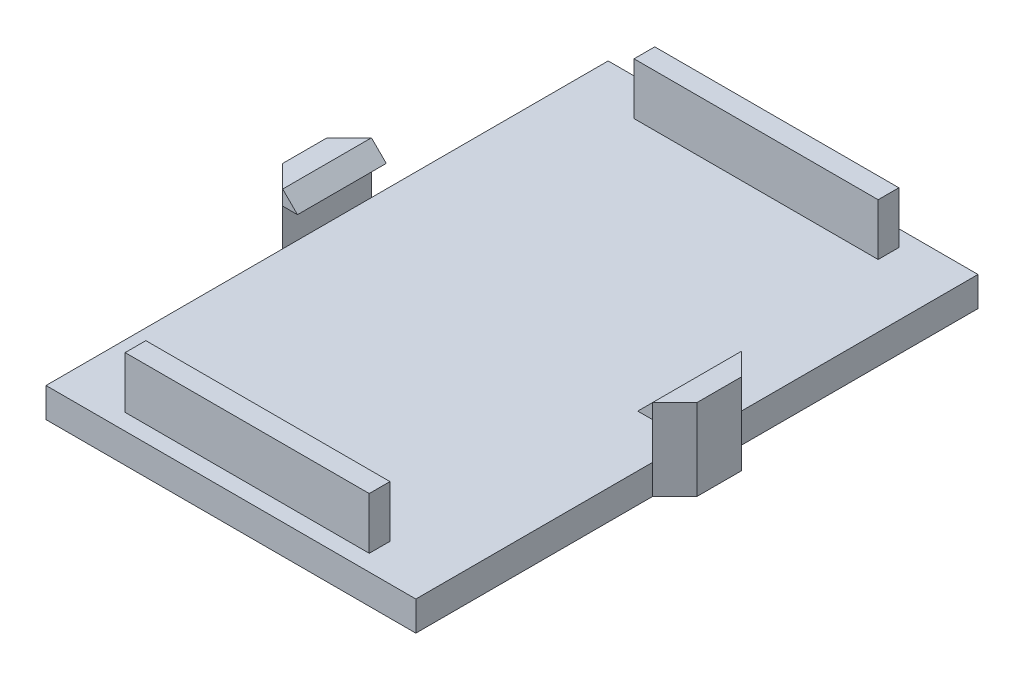
ISO-10303-21;
HEADER;
FILE_DESCRIPTION(('STEP AP214'),'2;1');
FILE_NAME('part.step','',(''),(''),'','','');
FILE_SCHEMA(('AUTOMOTIVE_DESIGN { 1 0 10303 214 1 1 1 1 }'));
ENDSEC;
DATA;
#1=APPLICATION_CONTEXT('core data for automotive mechanical design processes');
#2=APPLICATION_PROTOCOL_DEFINITION('international standard','automotive_design',2000,#1);
#3=PRODUCT_CONTEXT('',#1,'mechanical');
#4=PRODUCT('Part','Part','',(#3));
#5=PRODUCT_RELATED_PRODUCT_CATEGORY('part','',(#4));
#6=PRODUCT_DEFINITION_FORMATION('','',#4);
#7=PRODUCT_DEFINITION_CONTEXT('part definition',#1,'design');
#8=PRODUCT_DEFINITION('design','',#6,#7);
#9=PRODUCT_DEFINITION_SHAPE('','',#8);
#10=(LENGTH_UNIT() NAMED_UNIT(*) SI_UNIT(.MILLI.,.METRE.));
#11=(NAMED_UNIT(*) PLANE_ANGLE_UNIT() SI_UNIT($,.RADIAN.));
#12=(NAMED_UNIT(*) SI_UNIT($,.STERADIAN.) SOLID_ANGLE_UNIT());
#13=UNCERTAINTY_MEASURE_WITH_UNIT(LENGTH_MEASURE(1.E-05),#10,'distance_accuracy_value','');
#14=(GEOMETRIC_REPRESENTATION_CONTEXT(3) GLOBAL_UNCERTAINTY_ASSIGNED_CONTEXT((#13)) GLOBAL_UNIT_ASSIGNED_CONTEXT((#10,
#11,#12)) REPRESENTATION_CONTEXT('',''));
#15=CARTESIAN_POINT('',(0.,0.,0.));
#16=DIRECTION('',(0.,0.,1.));
#17=DIRECTION('',(1.,0.,0.));
#18=AXIS2_PLACEMENT_3D('',#15,#16,#17);
#19=CARTESIAN_POINT('',(-12.5,5.5,0.));
#20=DIRECTION('',(-1.,0.,0.));
#21=DIRECTION('',(0.,0.,1.));
#22=AXIS2_PLACEMENT_3D('',#19,#20,#21);
#23=PLANE('',#22);
#24=DIRECTION('',(0.,0.,-1.));
#25=VECTOR('',#24,1.);
#26=CARTESIAN_POINT('',(-12.5,4.5,2.99999999999999));
#27=LINE('',#26,#25);
#28=CARTESIAN_POINT('',(-12.5,4.5,2.99999999999999));
#29=VERTEX_POINT('',#28);
#30=CARTESIAN_POINT('',(-12.5,4.5,-3.));
#31=VERTEX_POINT('',#30);
#32=EDGE_CURVE('E241',#29,#31,#27,.T.);
#33=ORIENTED_EDGE('',*,*,#32,.F.);
#34=DIRECTION('',(0.,-1.,0.));
#35=VECTOR('',#34,1.);
#36=CARTESIAN_POINT('',(-12.5,5.5,2.99999999999999));
#37=LINE('',#36,#35);
#38=CARTESIAN_POINT('',(-12.5,2.,2.99999999999999));
#39=VERTEX_POINT('',#38);
#40=EDGE_CURVE('E386',#29,#39,#37,.T.);
#41=ORIENTED_EDGE('',*,*,#40,.T.);
#42=DIRECTION('',(0.,0.,-1.));
#43=VECTOR('',#42,1.);
#44=CARTESIAN_POINT('',(-12.5,2.,0.));
#45=LINE('',#44,#43);
#46=CARTESIAN_POINT('',(-12.5,2.,-2.99999999999999));
#47=VERTEX_POINT('',#46);
#48=EDGE_CURVE('E448',#39,#47,#45,.T.);
#49=ORIENTED_EDGE('',*,*,#48,.T.);
#50=DIRECTION('',(0.,-1.,0.));
#51=VECTOR('',#50,1.);
#52=CARTESIAN_POINT('',(-12.5,5.5,-2.99999999999999));
#53=LINE('',#52,#51);
#54=EDGE_CURVE('E406',#31,#47,#53,.T.);
#55=ORIENTED_EDGE('',*,*,#54,.F.);
#56=EDGE_LOOP('',(#33,#41,#49,#55));
#57=FACE_BOUND('',#56,.T.);
#58=ADVANCED_FACE('F47',(#57),#23,.F.);
#59=CARTESIAN_POINT('',(12.5,5.5,0.));
#60=DIRECTION('',(-1.,0.,0.));
#61=DIRECTION('',(0.,0.,1.));
#62=AXIS2_PLACEMENT_3D('',#59,#60,#61);
#63=PLANE('',#62);
#64=DIRECTION('',(0.,-1.,0.));
#65=VECTOR('',#64,1.);
#66=CARTESIAN_POINT('',(12.5,5.5,2.99999999999999));
#67=LINE('',#66,#65);
#68=CARTESIAN_POINT('',(12.5,4.5,2.99999999999999));
#69=VERTEX_POINT('',#68);
#70=CARTESIAN_POINT('',(12.5,2.,2.99999999999999));
#71=VERTEX_POINT('',#70);
#72=EDGE_CURVE('E60',#69,#71,#67,.T.);
#73=ORIENTED_EDGE('',*,*,#72,.F.);
#74=DIRECTION('',(0.,0.,-1.));
#75=VECTOR('',#74,1.);
#76=CARTESIAN_POINT('',(12.5,4.5,2.99999999999999));
#77=LINE('',#76,#75);
#78=CARTESIAN_POINT('',(12.5,4.5,-3.));
#79=VERTEX_POINT('',#78);
#80=EDGE_CURVE('E71',#69,#79,#77,.T.);
#81=ORIENTED_EDGE('',*,*,#80,.T.);
#82=DIRECTION('',(0.,-1.,0.));
#83=VECTOR('',#82,1.);
#84=CARTESIAN_POINT('',(12.5,5.5,-3.));
#85=LINE('',#84,#83);
#86=CARTESIAN_POINT('',(12.5,2.,-3.));
#87=VERTEX_POINT('',#86);
#88=EDGE_CURVE('E350',#79,#87,#85,.T.);
#89=ORIENTED_EDGE('',*,*,#88,.T.);
#90=DIRECTION('',(0.,0.,-1.));
#91=VECTOR('',#90,1.);
#92=CARTESIAN_POINT('',(12.5,2.,0.));
#93=LINE('',#92,#91);
#94=EDGE_CURVE('E438',#71,#87,#93,.T.);
#95=ORIENTED_EDGE('',*,*,#94,.F.);
#96=EDGE_LOOP('',(#73,#81,#89,#95));
#97=FACE_BOUND('',#96,.T.);
#98=ADVANCED_FACE('F580',(#97),#63,.T.);
#99=CARTESIAN_POINT('',(12.5,2.,0.));
#100=DIRECTION('',(-1.,0.,0.));
#101=DIRECTION('',(0.,0.,1.));
#102=AXIS2_PLACEMENT_3D('',#99,#100,#101);
#103=PLANE('',#102);
#104=CARTESIAN_POINT('',(12.5,0.,2.99999999999999));
#105=VERTEX_POINT('',#104);
#106=EDGE_CURVE('E11',#71,#105,#67,.T.);
#107=ORIENTED_EDGE('',*,*,#106,.F.);
#108=CARTESIAN_POINT('',(12.5,2.,19.));
#109=VERTEX_POINT('',#108);
#110=EDGE_CURVE('E433',#109,#71,#93,.T.);
#111=ORIENTED_EDGE('',*,*,#110,.F.);
#112=DIRECTION('',(0.,-1.,0.));
#113=VECTOR('',#112,1.);
#114=CARTESIAN_POINT('',(12.5,2.,19.));
#115=LINE('',#114,#113);
#116=CARTESIAN_POINT('',(12.5,0.,19.));
#117=VERTEX_POINT('',#116);
#118=EDGE_CURVE('E51',#109,#117,#115,.T.);
#119=ORIENTED_EDGE('',*,*,#118,.T.);
#120=DIRECTION('',(0.,0.,-1.));
#121=VECTOR('',#120,1.);
#122=CARTESIAN_POINT('',(12.5,0.,0.));
#123=LINE('',#122,#121);
#124=EDGE_CURVE('E468',#117,#105,#123,.T.);
#125=ORIENTED_EDGE('',*,*,#124,.T.);
#126=EDGE_LOOP('',(#107,#111,#119,#125));
#127=FACE_BOUND('',#126,.T.);
#128=ADVANCED_FACE('F523',(#127),#103,.F.);
#129=CARTESIAN_POINT('',(-12.5,2.,0.));
#130=DIRECTION('',(-1.,0.,0.));
#131=DIRECTION('',(0.,0.,1.));
#132=AXIS2_PLACEMENT_3D('',#129,#130,#131);
#133=PLANE('',#132);
#134=CARTESIAN_POINT('',(-12.5,2.,19.));
#135=VERTEX_POINT('',#134);
#136=EDGE_CURVE('E443',#135,#39,#45,.T.);
#137=ORIENTED_EDGE('',*,*,#136,.T.);
#138=CARTESIAN_POINT('',(-12.5,0.,2.99999999999999));
#139=VERTEX_POINT('',#138);
#140=EDGE_CURVE('E399',#39,#139,#37,.T.);
#141=ORIENTED_EDGE('',*,*,#140,.T.);
#142=DIRECTION('',(0.,0.,-1.));
#143=VECTOR('',#142,1.);
#144=CARTESIAN_POINT('',(-12.5,0.,0.));
#145=LINE('',#144,#143);
#146=CARTESIAN_POINT('',(-12.5,0.,19.));
#147=VERTEX_POINT('',#146);
#148=EDGE_CURVE('E417',#147,#139,#145,.T.);
#149=ORIENTED_EDGE('',*,*,#148,.F.);
#150=DIRECTION('',(0.,-1.,0.));
#151=VECTOR('',#150,1.);
#152=CARTESIAN_POINT('',(-12.5,2.,19.));
#153=LINE('',#152,#151);
#154=EDGE_CURVE('E463',#135,#147,#153,.T.);
#155=ORIENTED_EDGE('',*,*,#154,.F.);
#156=EDGE_LOOP('',(#137,#141,#149,#155));
#157=FACE_BOUND('',#156,.T.);
#158=ADVANCED_FACE('F517',(#157),#133,.T.);
#159=CARTESIAN_POINT('',(0.,2.,19.));
#160=DIRECTION('',(0.,0.,-1.));
#161=DIRECTION('',(-1.,0.,0.));
#162=AXIS2_PLACEMENT_3D('',#159,#160,#161);
#163=PLANE('',#162);
#164=DIRECTION('',(1.,0.,0.));
#165=VECTOR('',#164,1.);
#166=CARTESIAN_POINT('',(0.,0.,19.));
#167=LINE('',#166,#165);
#168=EDGE_CURVE('E411',#147,#117,#167,.T.);
#169=ORIENTED_EDGE('',*,*,#168,.T.);
#170=ORIENTED_EDGE('',*,*,#118,.F.);
#171=DIRECTION('',(1.,0.,0.));
#172=VECTOR('',#171,1.);
#173=CARTESIAN_POINT('',(0.,2.,19.));
#174=LINE('',#173,#172);
#175=EDGE_CURVE('E428',#135,#109,#174,.T.);
#176=ORIENTED_EDGE('',*,*,#175,.F.);
#177=ORIENTED_EDGE('',*,*,#154,.T.);
#178=EDGE_LOOP('',(#169,#170,#176,#177));
#179=FACE_BOUND('',#178,.T.);
#180=ADVANCED_FACE('F49',(#179),#163,.F.);
#181=CARTESIAN_POINT('',(12.5,2.,-19.));
#182=VERTEX_POINT('',#181);
#183=EDGE_CURVE('E432',#87,#182,#93,.T.);
#184=ORIENTED_EDGE('',*,*,#183,.F.);
#185=CARTESIAN_POINT('',(12.5,0.,-3.));
#186=VERTEX_POINT('',#185);
#187=EDGE_CURVE('E57',#87,#186,#85,.T.);
#188=ORIENTED_EDGE('',*,*,#187,.T.);
#189=CARTESIAN_POINT('',(12.5,0.,-19.));
#190=VERTEX_POINT('',#189);
#191=EDGE_CURVE('E467',#186,#190,#123,.T.);
#192=ORIENTED_EDGE('',*,*,#191,.T.);
#193=DIRECTION('',(0.,-1.,0.));
#194=VECTOR('',#193,1.);
#195=CARTESIAN_POINT('',(12.5,2.,-19.));
#196=LINE('',#195,#194);
#197=EDGE_CURVE('E485',#182,#190,#196,.T.);
#198=ORIENTED_EDGE('',*,*,#197,.F.);
#199=EDGE_LOOP('',(#184,#188,#192,#198));
#200=FACE_BOUND('',#199,.T.);
#201=ADVANCED_FACE('F561',(#200),#103,.F.);
#202=CARTESIAN_POINT('',(0.,2.,-19.));
#203=DIRECTION('',(0.,0.,-1.));
#204=DIRECTION('',(-1.,0.,0.));
#205=AXIS2_PLACEMENT_3D('',#202,#203,#204);
#206=PLANE('',#205);
#207=DIRECTION('',(1.,0.,0.));
#208=VECTOR('',#207,1.);
#209=CARTESIAN_POINT('',(0.,0.,-19.));
#210=LINE('',#209,#208);
#211=CARTESIAN_POINT('',(-12.5,0.,-19.));
#212=VERTEX_POINT('',#211);
#213=EDGE_CURVE('E472',#212,#190,#210,.T.);
#214=ORIENTED_EDGE('',*,*,#213,.F.);
#215=DIRECTION('',(0.,-1.,0.));
#216=VECTOR('',#215,1.);
#217=CARTESIAN_POINT('',(-12.5,2.,-19.));
#218=LINE('',#217,#216);
#219=CARTESIAN_POINT('',(-12.5,2.,-19.));
#220=VERTEX_POINT('',#219);
#221=EDGE_CURVE('E482',#220,#212,#218,.T.);
#222=ORIENTED_EDGE('',*,*,#221,.F.);
#223=DIRECTION('',(1.,0.,0.));
#224=VECTOR('',#223,1.);
#225=CARTESIAN_POINT('',(0.,2.,-19.));
#226=LINE('',#225,#224);
#227=EDGE_CURVE('E437',#220,#182,#226,.T.);
#228=ORIENTED_EDGE('',*,*,#227,.T.);
#229=ORIENTED_EDGE('',*,*,#197,.T.);
#230=EDGE_LOOP('',(#214,#222,#228,#229));
#231=FACE_BOUND('',#230,.T.);
#232=ADVANCED_FACE('F598',(#231),#206,.T.);
#233=CARTESIAN_POINT('',(-12.5,0.,-2.99999999999999));
#234=VERTEX_POINT('',#233);
#235=EDGE_CURVE('E412',#47,#234,#53,.T.);
#236=ORIENTED_EDGE('',*,*,#235,.F.);
#237=EDGE_CURVE('E442',#47,#220,#45,.T.);
#238=ORIENTED_EDGE('',*,*,#237,.T.);
#239=ORIENTED_EDGE('',*,*,#221,.T.);
#240=EDGE_CURVE('E476',#234,#212,#145,.T.);
#241=ORIENTED_EDGE('',*,*,#240,.F.);
#242=EDGE_LOOP('',(#236,#238,#239,#241));
#243=FACE_BOUND('',#242,.T.);
#244=ADVANCED_FACE('F592',(#243),#133,.T.);
#245=CARTESIAN_POINT('',(0.,2.,0.));
#246=DIRECTION('',(0.,1.,0.));
#247=DIRECTION('',(0.,0.,1.));
#248=AXIS2_PLACEMENT_3D('',#245,#246,#247);
#249=PLANE('',#248);
#250=DIRECTION('',(0.,0.,-1.));
#251=VECTOR('',#250,1.);
#252=CARTESIAN_POINT('',(8.25,2.,0.));
#253=LINE('',#252,#251);
#254=CARTESIAN_POINT('',(8.25,2.,-16.5));
#255=VERTEX_POINT('',#254);
#256=CARTESIAN_POINT('',(8.25,2.,-17.9));
#257=VERTEX_POINT('',#256);
#258=EDGE_CURVE('E413',#255,#257,#253,.T.);
#259=ORIENTED_EDGE('',*,*,#258,.F.);
#260=DIRECTION('',(1.,0.,0.));
#261=VECTOR('',#260,1.);
#262=CARTESIAN_POINT('',(0.,2.,-16.5));
#263=LINE('',#262,#261);
#264=CARTESIAN_POINT('',(-8.25,2.,-16.5));
#265=VERTEX_POINT('',#264);
#266=EDGE_CURVE('E416',#265,#255,#263,.T.);
#267=ORIENTED_EDGE('',*,*,#266,.F.);
#268=DIRECTION('',(0.,0.,-1.));
#269=VECTOR('',#268,1.);
#270=CARTESIAN_POINT('',(-8.25,2.,0.));
#271=LINE('',#270,#269);
#272=CARTESIAN_POINT('',(-8.25,2.,-17.9));
#273=VERTEX_POINT('',#272);
#274=EDGE_CURVE('E420',#265,#273,#271,.T.);
#275=ORIENTED_EDGE('',*,*,#274,.T.);
#276=DIRECTION('',(1.,0.,0.));
#277=VECTOR('',#276,1.);
#278=CARTESIAN_POINT('',(0.,2.,-17.9));
#279=LINE('',#278,#277);
#280=EDGE_CURVE('E424',#273,#257,#279,.T.);
#281=ORIENTED_EDGE('',*,*,#280,.T.);
#282=EDGE_LOOP('',(#259,#267,#275,#281));
#283=FACE_BOUND('',#282,.T.);
#284=ORIENTED_EDGE('',*,*,#175,.T.);
#285=ORIENTED_EDGE('',*,*,#110,.T.);
#286=ORIENTED_EDGE('',*,*,#94,.T.);
#287=ORIENTED_EDGE('',*,*,#183,.T.);
#288=ORIENTED_EDGE('',*,*,#227,.F.);
#289=ORIENTED_EDGE('',*,*,#237,.F.);
#290=ORIENTED_EDGE('',*,*,#48,.F.);
#291=ORIENTED_EDGE('',*,*,#136,.F.);
#292=EDGE_LOOP('',(#284,#285,#286,#287,#288,#289,#290,#291));
#293=FACE_BOUND('',#292,.T.);
#294=DIRECTION('',(0.,0.,1.));
#295=VECTOR('',#294,1.);
#296=CARTESIAN_POINT('',(-8.25,2.,0.));
#297=LINE('',#296,#295);
#298=CARTESIAN_POINT('',(-8.25,2.,16.5));
#299=VERTEX_POINT('',#298);
#300=CARTESIAN_POINT('',(-8.25,2.,17.9));
#301=VERTEX_POINT('',#300);
#302=EDGE_CURVE('E447',#299,#301,#297,.T.);
#303=ORIENTED_EDGE('',*,*,#302,.F.);
#304=DIRECTION('',(1.,0.,0.));
#305=VECTOR('',#304,1.);
#306=CARTESIAN_POINT('',(0.,2.,16.5));
#307=LINE('',#306,#305);
#308=CARTESIAN_POINT('',(8.25,2.,16.5));
#309=VERTEX_POINT('',#308);
#310=EDGE_CURVE('E451',#299,#309,#307,.T.);
#311=ORIENTED_EDGE('',*,*,#310,.T.);
#312=DIRECTION('',(0.,0.,1.));
#313=VECTOR('',#312,1.);
#314=CARTESIAN_POINT('',(8.25,2.,0.));
#315=LINE('',#314,#313);
#316=CARTESIAN_POINT('',(8.25,2.,17.9));
#317=VERTEX_POINT('',#316);
#318=EDGE_CURVE('E455',#309,#317,#315,.T.);
#319=ORIENTED_EDGE('',*,*,#318,.T.);
#320=DIRECTION('',(1.,0.,0.));
#321=VECTOR('',#320,1.);
#322=CARTESIAN_POINT('',(0.,2.,17.9));
#323=LINE('',#322,#321);
#324=EDGE_CURVE('E459',#301,#317,#323,.T.);
#325=ORIENTED_EDGE('',*,*,#324,.F.);
#326=EDGE_LOOP('',(#303,#311,#319,#325));
#327=FACE_BOUND('',#326,.T.);
#328=ADVANCED_FACE('F513',(#283,#293,#327),#249,.T.);
#329=CARTESIAN_POINT('',(0.,0.,0.));
#330=DIRECTION('',(0.,1.,0.));
#331=DIRECTION('',(0.,0.,1.));
#332=AXIS2_PLACEMENT_3D('',#329,#330,#331);
#333=PLANE('',#332);
#334=ORIENTED_EDGE('',*,*,#168,.F.);
#335=ORIENTED_EDGE('',*,*,#148,.T.);
#336=DIRECTION('',(-0.707106781186544,0.,-0.707106781186551));
#337=VECTOR('',#336,1.);
#338=CARTESIAN_POINT('',(-7.75000000000006,0.,7.74999999999998));
#339=LINE('',#338,#337);
#340=CARTESIAN_POINT('',(-14.,0.,1.49999999999998));
#341=VERTEX_POINT('',#340);
#342=EDGE_CURVE('E376',#139,#341,#339,.T.);
#343=ORIENTED_EDGE('',*,*,#342,.T.);
#344=DIRECTION('',(0.,0.,1.));
#345=VECTOR('',#344,1.);
#346=CARTESIAN_POINT('',(-14.,0.,0.));
#347=LINE('',#346,#345);
#348=CARTESIAN_POINT('',(-14.,0.,-1.49999999999998));
#349=VERTEX_POINT('',#348);
#350=EDGE_CURVE('E389',#349,#341,#347,.T.);
#351=ORIENTED_EDGE('',*,*,#350,.F.);
#352=DIRECTION('',(-0.707106781186544,0.,0.707106781186551));
#353=VECTOR('',#352,1.);
#354=CARTESIAN_POINT('',(-7.75000000000007,0.,-7.74999999999998));
#355=LINE('',#354,#353);
#356=EDGE_CURVE('E372',#234,#349,#355,.T.);
#357=ORIENTED_EDGE('',*,*,#356,.F.);
#358=ORIENTED_EDGE('',*,*,#240,.T.);
#359=ORIENTED_EDGE('',*,*,#213,.T.);
#360=ORIENTED_EDGE('',*,*,#191,.F.);
#361=DIRECTION('',(0.707106781186544,0.,0.707106781186551));
#362=VECTOR('',#361,1.);
#363=CARTESIAN_POINT('',(7.75000000000007,0.,-7.74999999999998));
#364=LINE('',#363,#362);
#365=CARTESIAN_POINT('',(14.,0.,-1.49999999999998));
#366=VERTEX_POINT('',#365);
#367=EDGE_CURVE('E339',#186,#366,#364,.T.);
#368=ORIENTED_EDGE('',*,*,#367,.T.);
#369=DIRECTION('',(0.,0.,1.));
#370=VECTOR('',#369,1.);
#371=CARTESIAN_POINT('',(14.,0.,0.));
#372=LINE('',#371,#370);
#373=CARTESIAN_POINT('',(14.,0.,1.49999999999998));
#374=VERTEX_POINT('',#373);
#375=EDGE_CURVE('E354',#366,#374,#372,.T.);
#376=ORIENTED_EDGE('',*,*,#375,.T.);
#377=DIRECTION('',(0.707106781186544,0.,-0.707106781186551));
#378=VECTOR('',#377,1.);
#379=CARTESIAN_POINT('',(7.75000000000006,0.,7.74999999999998));
#380=LINE('',#379,#378);
#381=EDGE_CURVE('E333',#105,#374,#380,.T.);
#382=ORIENTED_EDGE('',*,*,#381,.F.);
#383=ORIENTED_EDGE('',*,*,#124,.F.);
#384=EDGE_LOOP('',(#334,#335,#343,#351,#357,#358,#359,#360,#368,#376,#382,#383));
#385=FACE_BOUND('',#384,.T.);
#386=ADVANCED_FACE('F529',(#385),#333,.F.);
#387=CARTESIAN_POINT('',(-7.75000000000007,5.5,-7.74999999999998));
#388=DIRECTION('',(0.707106781186551,0.,0.707106781186544));
#389=DIRECTION('',(0.707106781186544,0.,-0.707106781186551));
#390=AXIS2_PLACEMENT_3D('',#387,#388,#389);
#391=PLANE('',#390);
#392=ORIENTED_EDGE('',*,*,#356,.T.);
#393=DIRECTION('',(0.,-1.,0.));
#394=VECTOR('',#393,1.);
#395=CARTESIAN_POINT('',(-14.,5.5,-1.49999999999998));
#396=LINE('',#395,#394);
#397=CARTESIAN_POINT('',(-14.,5.5,-1.49999999999998));
#398=VERTEX_POINT('',#397);
#399=EDGE_CURVE('E402',#398,#349,#396,.T.);
#400=ORIENTED_EDGE('',*,*,#399,.F.);
#401=DIRECTION('',(-0.707106781186544,0.,0.707106781186551));
#402=VECTOR('',#401,1.);
#403=CARTESIAN_POINT('',(-7.75000000000007,5.5,-7.74999999999998));
#404=LINE('',#403,#402);
#405=CARTESIAN_POINT('',(-12.5,5.5,-2.99999999999999));
#406=VERTEX_POINT('',#405);
#407=EDGE_CURVE('E375',#406,#398,#404,.T.);
#408=ORIENTED_EDGE('',*,*,#407,.F.);
#409=EDGE_CURVE('E407',#406,#31,#53,.T.);
#410=ORIENTED_EDGE('',*,*,#409,.T.);
#411=ORIENTED_EDGE('',*,*,#54,.T.);
#412=ORIENTED_EDGE('',*,*,#235,.T.);
#413=EDGE_LOOP('',(#392,#400,#408,#410,#411,#412));
#414=FACE_BOUND('',#413,.T.);
#415=ADVANCED_FACE('F565',(#414),#391,.F.);
#416=CARTESIAN_POINT('',(-14.,5.5,0.));
#417=DIRECTION('',(1.,0.,0.));
#418=DIRECTION('',(0.,0.,-1.));
#419=AXIS2_PLACEMENT_3D('',#416,#417,#418);
#420=PLANE('',#419);
#421=ORIENTED_EDGE('',*,*,#350,.T.);
#422=DIRECTION('',(0.,-1.,0.));
#423=VECTOR('',#422,1.);
#424=CARTESIAN_POINT('',(-14.,5.5,1.49999999999998));
#425=LINE('',#424,#423);
#426=CARTESIAN_POINT('',(-14.,5.5,1.49999999999998));
#427=VERTEX_POINT('',#426);
#428=EDGE_CURVE('E398',#427,#341,#425,.T.);
#429=ORIENTED_EDGE('',*,*,#428,.F.);
#430=DIRECTION('',(0.,0.,1.));
#431=VECTOR('',#430,1.);
#432=CARTESIAN_POINT('',(-14.,5.5,0.));
#433=LINE('',#432,#431);
#434=EDGE_CURVE('E379',#398,#427,#433,.T.);
#435=ORIENTED_EDGE('',*,*,#434,.F.);
#436=ORIENTED_EDGE('',*,*,#399,.T.);
#437=EDGE_LOOP('',(#421,#429,#435,#436));
#438=FACE_BOUND('',#437,.T.);
#439=ADVANCED_FACE('F629',(#438),#420,.F.);
#440=CARTESIAN_POINT('',(-7.75000000000006,5.5,7.74999999999998));
#441=DIRECTION('',(-0.707106781186551,0.,0.707106781186544));
#442=DIRECTION('',(0.707106781186544,0.,0.707106781186551));
#443=AXIS2_PLACEMENT_3D('',#440,#441,#442);
#444=PLANE('',#443);
#445=ORIENTED_EDGE('',*,*,#342,.F.);
#446=ORIENTED_EDGE('',*,*,#140,.F.);
#447=ORIENTED_EDGE('',*,*,#40,.F.);
#448=CARTESIAN_POINT('',(-12.5,5.5,2.99999999999999));
#449=VERTEX_POINT('',#448);
#450=EDGE_CURVE('E228',#449,#29,#37,.T.);
#451=ORIENTED_EDGE('',*,*,#450,.F.);
#452=DIRECTION('',(-0.707106781186544,0.,-0.707106781186551));
#453=VECTOR('',#452,1.);
#454=CARTESIAN_POINT('',(-7.75000000000006,5.5,7.74999999999998));
#455=LINE('',#454,#453);
#456=EDGE_CURVE('E382',#449,#427,#455,.T.);
#457=ORIENTED_EDGE('',*,*,#456,.T.);
#458=ORIENTED_EDGE('',*,*,#428,.T.);
#459=EDGE_LOOP('',(#445,#446,#447,#451,#457,#458));
#460=FACE_BOUND('',#459,.T.);
#461=ADVANCED_FACE('F509',(#460),#444,.T.);
#462=CARTESIAN_POINT('',(0.,5.5,0.));
#463=DIRECTION('',(0.,1.,0.));
#464=DIRECTION('',(0.,0.,1.));
#465=AXIS2_PLACEMENT_3D('',#462,#463,#464);
#466=PLANE('',#465);
#467=DIRECTION('',(0.,0.,-1.));
#468=VECTOR('',#467,1.);
#469=CARTESIAN_POINT('',(-12.5,5.5,0.));
#470=LINE('',#469,#468);
#471=EDGE_CURVE('E245',#449,#406,#470,.T.);
#472=ORIENTED_EDGE('',*,*,#471,.T.);
#473=ORIENTED_EDGE('',*,*,#407,.T.);
#474=ORIENTED_EDGE('',*,*,#434,.T.);
#475=ORIENTED_EDGE('',*,*,#456,.F.);
#476=EDGE_LOOP('',(#472,#473,#474,#475));
#477=FACE_BOUND('',#476,.T.);
#478=ADVANCED_FACE('F644',(#477),#466,.T.);
#479=CARTESIAN_POINT('',(7.75000000000006,5.5,7.74999999999998));
#480=DIRECTION('',(-0.707106781186551,0.,-0.707106781186544));
#481=DIRECTION('',(-0.707106781186544,0.,0.707106781186551));
#482=AXIS2_PLACEMENT_3D('',#479,#480,#481);
#483=PLANE('',#482);
#484=ORIENTED_EDGE('',*,*,#381,.T.);
#485=DIRECTION('',(0.,-1.,0.));
#486=VECTOR('',#485,1.);
#487=CARTESIAN_POINT('',(14.,5.5,1.49999999999998));
#488=LINE('',#487,#486);
#489=CARTESIAN_POINT('',(14.,5.5,1.49999999999998));
#490=VERTEX_POINT('',#489);
#491=EDGE_CURVE('E368',#490,#374,#488,.T.);
#492=ORIENTED_EDGE('',*,*,#491,.F.);
#493=DIRECTION('',(0.707106781186544,0.,-0.707106781186551));
#494=VECTOR('',#493,1.);
#495=CARTESIAN_POINT('',(7.75000000000006,5.5,7.74999999999998));
#496=LINE('',#495,#494);
#497=CARTESIAN_POINT('',(12.5,5.5,2.99999999999999));
#498=VERTEX_POINT('',#497);
#499=EDGE_CURVE('E338',#498,#490,#496,.T.);
#500=ORIENTED_EDGE('',*,*,#499,.F.);
#501=EDGE_CURVE('E59',#498,#69,#67,.T.);
#502=ORIENTED_EDGE('',*,*,#501,.T.);
#503=ORIENTED_EDGE('',*,*,#72,.T.);
#504=ORIENTED_EDGE('',*,*,#106,.T.);
#505=EDGE_LOOP('',(#484,#492,#500,#502,#503,#504));
#506=FACE_BOUND('',#505,.T.);
#507=ADVANCED_FACE('F526',(#506),#483,.F.);
#508=CARTESIAN_POINT('',(14.,5.5,0.));
#509=DIRECTION('',(1.,0.,0.));
#510=DIRECTION('',(0.,0.,-1.));
#511=AXIS2_PLACEMENT_3D('',#508,#509,#510);
#512=PLANE('',#511);
#513=ORIENTED_EDGE('',*,*,#375,.F.);
#514=DIRECTION('',(0.,-1.,0.));
#515=VECTOR('',#514,1.);
#516=CARTESIAN_POINT('',(14.,5.5,-1.49999999999998));
#517=LINE('',#516,#515);
#518=CARTESIAN_POINT('',(14.,5.5,-1.49999999999998));
#519=VERTEX_POINT('',#518);
#520=EDGE_CURVE('E365',#519,#366,#517,.T.);
#521=ORIENTED_EDGE('',*,*,#520,.F.);
#522=DIRECTION('',(0.,0.,1.));
#523=VECTOR('',#522,1.);
#524=CARTESIAN_POINT('',(14.,5.5,0.));
#525=LINE('',#524,#523);
#526=EDGE_CURVE('E342',#519,#490,#525,.T.);
#527=ORIENTED_EDGE('',*,*,#526,.T.);
#528=ORIENTED_EDGE('',*,*,#491,.T.);
#529=EDGE_LOOP('',(#513,#521,#527,#528));
#530=FACE_BOUND('',#529,.T.);
#531=ADVANCED_FACE('F533',(#530),#512,.T.);
#532=CARTESIAN_POINT('',(7.75000000000007,5.5,-7.74999999999998));
#533=DIRECTION('',(0.707106781186551,0.,-0.707106781186544));
#534=DIRECTION('',(-0.707106781186544,0.,-0.707106781186551));
#535=AXIS2_PLACEMENT_3D('',#532,#533,#534);
#536=PLANE('',#535);
#537=ORIENTED_EDGE('',*,*,#367,.F.);
#538=ORIENTED_EDGE('',*,*,#187,.F.);
#539=ORIENTED_EDGE('',*,*,#88,.F.);
#540=CARTESIAN_POINT('',(12.5,5.5,-3.));
#541=VERTEX_POINT('',#540);
#542=EDGE_CURVE('E361',#541,#79,#85,.T.);
#543=ORIENTED_EDGE('',*,*,#542,.F.);
#544=DIRECTION('',(0.707106781186544,0.,0.707106781186551));
#545=VECTOR('',#544,1.);
#546=CARTESIAN_POINT('',(7.75000000000007,5.5,-7.74999999999998));
#547=LINE('',#546,#545);
#548=EDGE_CURVE('E346',#541,#519,#547,.T.);
#549=ORIENTED_EDGE('',*,*,#548,.T.);
#550=ORIENTED_EDGE('',*,*,#520,.T.);
#551=EDGE_LOOP('',(#537,#538,#539,#543,#549,#550));
#552=FACE_BOUND('',#551,.T.);
#553=ADVANCED_FACE('F554',(#552),#536,.T.);
#554=CARTESIAN_POINT('',(0.,5.5,0.));
#555=DIRECTION('',(0.,1.,0.));
#556=DIRECTION('',(0.,0.,1.));
#557=AXIS2_PLACEMENT_3D('',#554,#555,#556);
#558=PLANE('',#557);
#559=DIRECTION('',(0.,0.,-1.));
#560=VECTOR('',#559,1.);
#561=CARTESIAN_POINT('',(12.5,5.5,0.));
#562=LINE('',#561,#560);
#563=EDGE_CURVE('E334',#498,#541,#562,.T.);
#564=ORIENTED_EDGE('',*,*,#563,.F.);
#565=ORIENTED_EDGE('',*,*,#499,.T.);
#566=ORIENTED_EDGE('',*,*,#526,.F.);
#567=ORIENTED_EDGE('',*,*,#548,.F.);
#568=EDGE_LOOP('',(#564,#565,#566,#567));
#569=FACE_BOUND('',#568,.T.);
#570=ADVANCED_FACE('F539',(#569),#558,.T.);
#571=CARTESIAN_POINT('',(0.,5.5,-16.5));
#572=DIRECTION('',(0.,0.,-1.));
#573=DIRECTION('',(-1.,0.,0.));
#574=AXIS2_PLACEMENT_3D('',#571,#572,#573);
#575=PLANE('',#574);
#576=ORIENTED_EDGE('',*,*,#266,.T.);
#577=DIRECTION('',(0.,-1.,0.));
#578=VECTOR('',#577,1.);
#579=CARTESIAN_POINT('',(8.25,5.5,-16.5));
#580=LINE('',#579,#578);
#581=CARTESIAN_POINT('',(8.25,5.5,-16.5));
#582=VERTEX_POINT('',#581);
#583=EDGE_CURVE('E329',#582,#255,#580,.T.);
#584=ORIENTED_EDGE('',*,*,#583,.F.);
#585=DIRECTION('',(1.,0.,0.));
#586=VECTOR('',#585,1.);
#587=CARTESIAN_POINT('',(0.,5.5,-16.5));
#588=LINE('',#587,#586);
#589=CARTESIAN_POINT('',(-8.25,5.5,-16.5));
#590=VERTEX_POINT('',#589);
#591=EDGE_CURVE('E303',#590,#582,#588,.T.);
#592=ORIENTED_EDGE('',*,*,#591,.F.);
#593=DIRECTION('',(0.,-1.,0.));
#594=VECTOR('',#593,1.);
#595=CARTESIAN_POINT('',(-8.25,5.5,-16.5));
#596=LINE('',#595,#594);
#597=EDGE_CURVE('E318',#590,#265,#596,.T.);
#598=ORIENTED_EDGE('',*,*,#597,.T.);
#599=EDGE_LOOP('',(#576,#584,#592,#598));
#600=FACE_BOUND('',#599,.T.);
#601=ADVANCED_FACE('F681',(#600),#575,.F.);
#602=CARTESIAN_POINT('',(8.25,5.5,0.));
#603=DIRECTION('',(-1.,0.,0.));
#604=DIRECTION('',(0.,0.,1.));
#605=AXIS2_PLACEMENT_3D('',#602,#603,#604);
#606=PLANE('',#605);
#607=ORIENTED_EDGE('',*,*,#258,.T.);
#608=DIRECTION('',(0.,-1.,0.));
#609=VECTOR('',#608,1.);
#610=CARTESIAN_POINT('',(8.25,5.5,-17.9));
#611=LINE('',#610,#609);
#612=CARTESIAN_POINT('',(8.25,5.5,-17.9));
#613=VERTEX_POINT('',#612);
#614=EDGE_CURVE('E325',#613,#257,#611,.T.);
#615=ORIENTED_EDGE('',*,*,#614,.F.);
#616=DIRECTION('',(0.,0.,-1.));
#617=VECTOR('',#616,1.);
#618=CARTESIAN_POINT('',(8.25,5.5,0.));
#619=LINE('',#618,#617);
#620=EDGE_CURVE('E307',#582,#613,#619,.T.);
#621=ORIENTED_EDGE('',*,*,#620,.F.);
#622=ORIENTED_EDGE('',*,*,#583,.T.);
#623=EDGE_LOOP('',(#607,#615,#621,#622));
#624=FACE_BOUND('',#623,.T.);
#625=ADVANCED_FACE('F689',(#624),#606,.F.);
#626=CARTESIAN_POINT('',(0.,5.5,-17.9));
#627=DIRECTION('',(0.,0.,-1.));
#628=DIRECTION('',(-1.,0.,0.));
#629=AXIS2_PLACEMENT_3D('',#626,#627,#628);
#630=PLANE('',#629);
#631=ORIENTED_EDGE('',*,*,#614,.T.);
#632=ORIENTED_EDGE('',*,*,#280,.F.);
#633=DIRECTION('',(0.,-1.,0.));
#634=VECTOR('',#633,1.);
#635=CARTESIAN_POINT('',(-8.25,5.5,-17.9));
#636=LINE('',#635,#634);
#637=CARTESIAN_POINT('',(-8.25,5.5,-17.9));
#638=VERTEX_POINT('',#637);
#639=EDGE_CURVE('E322',#638,#273,#636,.T.);
#640=ORIENTED_EDGE('',*,*,#639,.F.);
#641=DIRECTION('',(1.,0.,0.));
#642=VECTOR('',#641,1.);
#643=CARTESIAN_POINT('',(0.,5.5,-17.9));
#644=LINE('',#643,#642);
#645=EDGE_CURVE('E310',#638,#613,#644,.T.);
#646=ORIENTED_EDGE('',*,*,#645,.T.);
#647=EDGE_LOOP('',(#631,#632,#640,#646));
#648=FACE_BOUND('',#647,.T.);
#649=ADVANCED_FACE('F698',(#648),#630,.T.);
#650=CARTESIAN_POINT('',(-8.25,5.5,0.));
#651=DIRECTION('',(-1.,0.,0.));
#652=DIRECTION('',(0.,0.,1.));
#653=AXIS2_PLACEMENT_3D('',#650,#651,#652);
#654=PLANE('',#653);
#655=ORIENTED_EDGE('',*,*,#639,.T.);
#656=ORIENTED_EDGE('',*,*,#274,.F.);
#657=ORIENTED_EDGE('',*,*,#597,.F.);
#658=DIRECTION('',(0.,0.,-1.));
#659=VECTOR('',#658,1.);
#660=CARTESIAN_POINT('',(-8.25,5.5,0.));
#661=LINE('',#660,#659);
#662=EDGE_CURVE('E314',#590,#638,#661,.T.);
#663=ORIENTED_EDGE('',*,*,#662,.T.);
#664=EDGE_LOOP('',(#655,#656,#657,#663));
#665=FACE_BOUND('',#664,.T.);
#666=ADVANCED_FACE('F707',(#665),#654,.T.);
#667=CARTESIAN_POINT('',(0.,5.5,0.));
#668=DIRECTION('',(0.,1.,0.));
#669=DIRECTION('',(0.,0.,1.));
#670=AXIS2_PLACEMENT_3D('',#667,#668,#669);
#671=PLANE('',#670);
#672=ORIENTED_EDGE('',*,*,#591,.T.);
#673=ORIENTED_EDGE('',*,*,#620,.T.);
#674=ORIENTED_EDGE('',*,*,#645,.F.);
#675=ORIENTED_EDGE('',*,*,#662,.F.);
#676=EDGE_LOOP('',(#672,#673,#674,#675));
#677=FACE_BOUND('',#676,.T.);
#678=ADVANCED_FACE('F716',(#677),#671,.T.);
#679=CARTESIAN_POINT('',(0.,5.5,16.5));
#680=DIRECTION('',(0.,0.,-1.));
#681=DIRECTION('',(-1.,0.,0.));
#682=AXIS2_PLACEMENT_3D('',#679,#680,#681);
#683=PLANE('',#682);
#684=DIRECTION('',(0.,-1.,0.));
#685=VECTOR('',#684,1.);
#686=CARTESIAN_POINT('',(8.25,5.5,16.5));
#687=LINE('',#686,#685);
#688=CARTESIAN_POINT('',(8.25,5.5,16.5));
#689=VERTEX_POINT('',#688);
#690=EDGE_CURVE('E288',#689,#309,#687,.T.);
#691=ORIENTED_EDGE('',*,*,#690,.T.);
#692=ORIENTED_EDGE('',*,*,#310,.F.);
#693=DIRECTION('',(0.,-1.,0.));
#694=VECTOR('',#693,1.);
#695=CARTESIAN_POINT('',(-8.25,5.5,16.5));
#696=LINE('',#695,#694);
#697=CARTESIAN_POINT('',(-8.25,5.5,16.5));
#698=VERTEX_POINT('',#697);
#699=EDGE_CURVE('E299',#698,#299,#696,.T.);
#700=ORIENTED_EDGE('',*,*,#699,.F.);
#701=DIRECTION('',(1.,0.,0.));
#702=VECTOR('',#701,1.);
#703=CARTESIAN_POINT('',(0.,5.5,16.5));
#704=LINE('',#703,#702);
#705=EDGE_CURVE('E274',#698,#689,#704,.T.);
#706=ORIENTED_EDGE('',*,*,#705,.T.);
#707=EDGE_LOOP('',(#691,#692,#700,#706));
#708=FACE_BOUND('',#707,.T.);
#709=ADVANCED_FACE('F725',(#708),#683,.T.);
#710=CARTESIAN_POINT('',(-8.25,5.5,0.));
#711=DIRECTION('',(1.,0.,0.));
#712=DIRECTION('',(0.,0.,-1.));
#713=AXIS2_PLACEMENT_3D('',#710,#711,#712);
#714=PLANE('',#713);
#715=ORIENTED_EDGE('',*,*,#302,.T.);
#716=DIRECTION('',(0.,-1.,0.));
#717=VECTOR('',#716,1.);
#718=CARTESIAN_POINT('',(-8.25,5.5,17.9));
#719=LINE('',#718,#717);
#720=CARTESIAN_POINT('',(-8.25,5.5,17.9));
#721=VERTEX_POINT('',#720);
#722=EDGE_CURVE('E295',#721,#301,#719,.T.);
#723=ORIENTED_EDGE('',*,*,#722,.F.);
#724=DIRECTION('',(0.,0.,1.));
#725=VECTOR('',#724,1.);
#726=CARTESIAN_POINT('',(-8.25,5.5,0.));
#727=LINE('',#726,#725);
#728=EDGE_CURVE('E278',#698,#721,#727,.T.);
#729=ORIENTED_EDGE('',*,*,#728,.F.);
#730=ORIENTED_EDGE('',*,*,#699,.T.);
#731=EDGE_LOOP('',(#715,#723,#729,#730));
#732=FACE_BOUND('',#731,.T.);
#733=ADVANCED_FACE('F734',(#732),#714,.F.);
#734=CARTESIAN_POINT('',(0.,5.5,17.9));
#735=DIRECTION('',(0.,0.,-1.));
#736=DIRECTION('',(-1.,0.,0.));
#737=AXIS2_PLACEMENT_3D('',#734,#735,#736);
#738=PLANE('',#737);
#739=ORIENTED_EDGE('',*,*,#324,.T.);
#740=DIRECTION('',(0.,-1.,0.));
#741=VECTOR('',#740,1.);
#742=CARTESIAN_POINT('',(8.25,5.5,17.9));
#743=LINE('',#742,#741);
#744=CARTESIAN_POINT('',(8.25,5.5,17.9));
#745=VERTEX_POINT('',#744);
#746=EDGE_CURVE('E292',#745,#317,#743,.T.);
#747=ORIENTED_EDGE('',*,*,#746,.F.);
#748=DIRECTION('',(1.,0.,0.));
#749=VECTOR('',#748,1.);
#750=CARTESIAN_POINT('',(0.,5.5,17.9));
#751=LINE('',#750,#749);
#752=EDGE_CURVE('E281',#721,#745,#751,.T.);
#753=ORIENTED_EDGE('',*,*,#752,.F.);
#754=ORIENTED_EDGE('',*,*,#722,.T.);
#755=EDGE_LOOP('',(#739,#747,#753,#754));
#756=FACE_BOUND('',#755,.T.);
#757=ADVANCED_FACE('F743',(#756),#738,.F.);
#758=CARTESIAN_POINT('',(8.25,5.5,0.));
#759=DIRECTION('',(1.,0.,0.));
#760=DIRECTION('',(0.,0.,-1.));
#761=AXIS2_PLACEMENT_3D('',#758,#759,#760);
#762=PLANE('',#761);
#763=ORIENTED_EDGE('',*,*,#746,.T.);
#764=ORIENTED_EDGE('',*,*,#318,.F.);
#765=ORIENTED_EDGE('',*,*,#690,.F.);
#766=DIRECTION('',(0.,0.,1.));
#767=VECTOR('',#766,1.);
#768=CARTESIAN_POINT('',(8.25,5.5,0.));
#769=LINE('',#768,#767);
#770=EDGE_CURVE('E284',#689,#745,#769,.T.);
#771=ORIENTED_EDGE('',*,*,#770,.T.);
#772=EDGE_LOOP('',(#763,#764,#765,#771));
#773=FACE_BOUND('',#772,.T.);
#774=ADVANCED_FACE('F752',(#773),#762,.T.);
#775=CARTESIAN_POINT('',(0.,5.5,0.));
#776=DIRECTION('',(0.,1.,0.));
#777=DIRECTION('',(0.,0.,1.));
#778=AXIS2_PLACEMENT_3D('',#775,#776,#777);
#779=PLANE('',#778);
#780=ORIENTED_EDGE('',*,*,#705,.F.);
#781=ORIENTED_EDGE('',*,*,#728,.T.);
#782=ORIENTED_EDGE('',*,*,#752,.T.);
#783=ORIENTED_EDGE('',*,*,#770,.F.);
#784=EDGE_LOOP('',(#780,#781,#782,#783));
#785=FACE_BOUND('',#784,.T.);
#786=ADVANCED_FACE('F761',(#785),#779,.T.);
#787=CARTESIAN_POINT('',(12.5,5.5,2.99999999999999));
#788=DIRECTION('',(0.707106781186547,-0.707106781186547,0.));
#789=DIRECTION('',(0.707106781186548,0.707106781186548,0.));
#790=AXIS2_PLACEMENT_3D('',#787,#788,#789);
#791=PLANE('',#790);
#792=ORIENTED_EDGE('',*,*,#563,.T.);
#793=DIRECTION('',(-0.707106781186548,-0.707106781186548,0.));
#794=VECTOR('',#793,1.);
#795=CARTESIAN_POINT('',(12.5,5.5,-3.));
#796=LINE('',#795,#794);
#797=CARTESIAN_POINT('',(11.5,4.5,-3.));
#798=VERTEX_POINT('',#797);
#799=EDGE_CURVE('E254',#541,#798,#796,.T.);
#800=ORIENTED_EDGE('',*,*,#799,.T.);
#801=DIRECTION('',(0.,0.,-1.));
#802=VECTOR('',#801,1.);
#803=CARTESIAN_POINT('',(11.5,4.5,2.99999999999999));
#804=LINE('',#803,#802);
#805=CARTESIAN_POINT('',(11.5,4.5,2.99999999999999));
#806=VERTEX_POINT('',#805);
#807=EDGE_CURVE('E271',#806,#798,#804,.T.);
#808=ORIENTED_EDGE('',*,*,#807,.F.);
#809=DIRECTION('',(-0.707106781186548,-0.707106781186548,0.));
#810=VECTOR('',#809,1.);
#811=CARTESIAN_POINT('',(12.5,5.5,2.99999999999999));
#812=LINE('',#811,#810);
#813=EDGE_CURVE('E262',#498,#806,#812,.T.);
#814=ORIENTED_EDGE('',*,*,#813,.F.);
#815=EDGE_LOOP('',(#792,#800,#808,#814));
#816=FACE_BOUND('',#815,.T.);
#817=ADVANCED_FACE('F544',(#816),#791,.F.);
#818=CARTESIAN_POINT('',(11.5,4.5,2.99999999999999));
#819=DIRECTION('',(0.,1.,0.));
#820=DIRECTION('',(0.,0.,1.));
#821=AXIS2_PLACEMENT_3D('',#818,#819,#820);
#822=PLANE('',#821);
#823=ORIENTED_EDGE('',*,*,#807,.T.);
#824=DIRECTION('',(1.,0.,0.));
#825=VECTOR('',#824,1.);
#826=CARTESIAN_POINT('',(11.5,4.5,-3.));
#827=LINE('',#826,#825);
#828=EDGE_CURVE('E258',#798,#79,#827,.T.);
#829=ORIENTED_EDGE('',*,*,#828,.T.);
#830=ORIENTED_EDGE('',*,*,#80,.F.);
#831=DIRECTION('',(1.,0.,0.));
#832=VECTOR('',#831,1.);
#833=CARTESIAN_POINT('',(11.5,4.5,2.99999999999999));
#834=LINE('',#833,#832);
#835=EDGE_CURVE('E265',#806,#69,#834,.T.);
#836=ORIENTED_EDGE('',*,*,#835,.F.);
#837=EDGE_LOOP('',(#823,#829,#830,#836));
#838=FACE_BOUND('',#837,.T.);
#839=ADVANCED_FACE('F549',(#838),#822,.F.);
#840=CARTESIAN_POINT('',(0.,0.,2.99999999999999));
#841=DIRECTION('',(0.,0.,-1.));
#842=DIRECTION('',(-1.,0.,0.));
#843=AXIS2_PLACEMENT_3D('',#840,#841,#842);
#844=PLANE('',#843);
#845=ORIENTED_EDGE('',*,*,#501,.F.);
#846=ORIENTED_EDGE('',*,*,#813,.T.);
#847=ORIENTED_EDGE('',*,*,#835,.T.);
#848=EDGE_LOOP('',(#845,#846,#847));
#849=FACE_BOUND('',#848,.T.);
#850=ADVANCED_FACE('F547',(#849),#844,.F.);
#851=CARTESIAN_POINT('',(0.,0.,-3.));
#852=DIRECTION('',(0.,0.,-1.));
#853=DIRECTION('',(-1.,0.,0.));
#854=AXIS2_PLACEMENT_3D('',#851,#852,#853);
#855=PLANE('',#854);
#856=ORIENTED_EDGE('',*,*,#542,.T.);
#857=ORIENTED_EDGE('',*,*,#828,.F.);
#858=ORIENTED_EDGE('',*,*,#799,.F.);
#859=EDGE_LOOP('',(#856,#857,#858));
#860=FACE_BOUND('',#859,.T.);
#861=ADVANCED_FACE('F552',(#860),#855,.T.);
#862=CARTESIAN_POINT('',(-12.5,5.5,2.99999999999999));
#863=DIRECTION('',(-0.707106781186547,-0.707106781186547,0.));
#864=DIRECTION('',(0.707106781186548,-0.707106781186548,0.));
#865=AXIS2_PLACEMENT_3D('',#862,#863,#864);
#866=PLANE('',#865);
#867=DIRECTION('',(0.,0.,-1.));
#868=VECTOR('',#867,1.);
#869=CARTESIAN_POINT('',(-11.5,4.5,2.99999999999999));
#870=LINE('',#869,#868);
#871=CARTESIAN_POINT('',(-11.5,4.5,2.99999999999999));
#872=VERTEX_POINT('',#871);
#873=CARTESIAN_POINT('',(-11.5,4.5,-3.));
#874=VERTEX_POINT('',#873);
#875=EDGE_CURVE('E232',#872,#874,#870,.T.);
#876=ORIENTED_EDGE('',*,*,#875,.T.);
#877=DIRECTION('',(-0.707106781186548,0.707106781186548,0.));
#878=VECTOR('',#877,1.);
#879=CARTESIAN_POINT('',(-12.5,5.5,-3.));
#880=LINE('',#879,#878);
#881=EDGE_CURVE('E249',#874,#406,#880,.T.);
#882=ORIENTED_EDGE('',*,*,#881,.T.);
#883=ORIENTED_EDGE('',*,*,#471,.F.);
#884=DIRECTION('',(-0.707106781186548,0.707106781186548,0.));
#885=VECTOR('',#884,1.);
#886=CARTESIAN_POINT('',(-12.5,5.5,2.99999999999999));
#887=LINE('',#886,#885);
#888=EDGE_CURVE('E225',#872,#449,#887,.T.);
#889=ORIENTED_EDGE('',*,*,#888,.F.);
#890=EDGE_LOOP('',(#876,#882,#883,#889));
#891=FACE_BOUND('',#890,.T.);
#892=ADVANCED_FACE('F243',(#891),#866,.F.);
#893=CARTESIAN_POINT('',(-11.5,4.5,2.99999999999999));
#894=DIRECTION('',(0.,1.,0.));
#895=DIRECTION('',(0.,0.,1.));
#896=AXIS2_PLACEMENT_3D('',#893,#894,#895);
#897=PLANE('',#896);
#898=ORIENTED_EDGE('',*,*,#32,.T.);
#899=DIRECTION('',(1.,0.,0.));
#900=VECTOR('',#899,1.);
#901=CARTESIAN_POINT('',(-11.5,4.5,-3.));
#902=LINE('',#901,#900);
#903=EDGE_CURVE('E237',#31,#874,#902,.T.);
#904=ORIENTED_EDGE('',*,*,#903,.T.);
#905=ORIENTED_EDGE('',*,*,#875,.F.);
#906=DIRECTION('',(1.,0.,0.));
#907=VECTOR('',#906,1.);
#908=CARTESIAN_POINT('',(-11.5,4.5,2.99999999999999));
#909=LINE('',#908,#907);
#910=EDGE_CURVE('E221',#29,#872,#909,.T.);
#911=ORIENTED_EDGE('',*,*,#910,.F.);
#912=EDGE_LOOP('',(#898,#904,#905,#911));
#913=FACE_BOUND('',#912,.T.);
#914=ADVANCED_FACE('F235',(#913),#897,.F.);
#915=CARTESIAN_POINT('',(0.,0.,2.99999999999999));
#916=DIRECTION('',(0.,0.,-1.));
#917=DIRECTION('',(-1.,0.,0.));
#918=AXIS2_PLACEMENT_3D('',#915,#916,#917);
#919=PLANE('',#918);
#920=ORIENTED_EDGE('',*,*,#888,.T.);
#921=ORIENTED_EDGE('',*,*,#450,.T.);
#922=ORIENTED_EDGE('',*,*,#910,.T.);
#923=EDGE_LOOP('',(#920,#921,#922));
#924=FACE_BOUND('',#923,.T.);
#925=ADVANCED_FACE('F223',(#924),#919,.F.);
#926=CARTESIAN_POINT('',(0.,0.,-3.));
#927=DIRECTION('',(0.,0.,-1.));
#928=DIRECTION('',(-1.,0.,0.));
#929=AXIS2_PLACEMENT_3D('',#926,#927,#928);
#930=PLANE('',#929);
#931=ORIENTED_EDGE('',*,*,#881,.F.);
#932=ORIENTED_EDGE('',*,*,#903,.F.);
#933=ORIENTED_EDGE('',*,*,#409,.F.);
#934=EDGE_LOOP('',(#931,#932,#933));
#935=FACE_BOUND('',#934,.T.);
#936=ADVANCED_FACE('F571',(#935),#930,.T.);
#937=CLOSED_SHELL('',(#58,#98,#128,#158,#180,#201,#232,#244,#328,#386,#415,#439,#461,#478,#507,
#531,#553,#570,#601,#625,#649,#666,#678,#709,#733,#757,#774,#786,#817,#839,#850,#861,#892,#914,
#925,#936));
#938=MANIFOLD_SOLID_BREP('B2',#937);
#939=ADVANCED_BREP_SHAPE_REPRESENTATION('',(#18,#938),#14);
#940=SHAPE_DEFINITION_REPRESENTATION(#9,#939);
ENDSEC;
END-ISO-10303-21;
